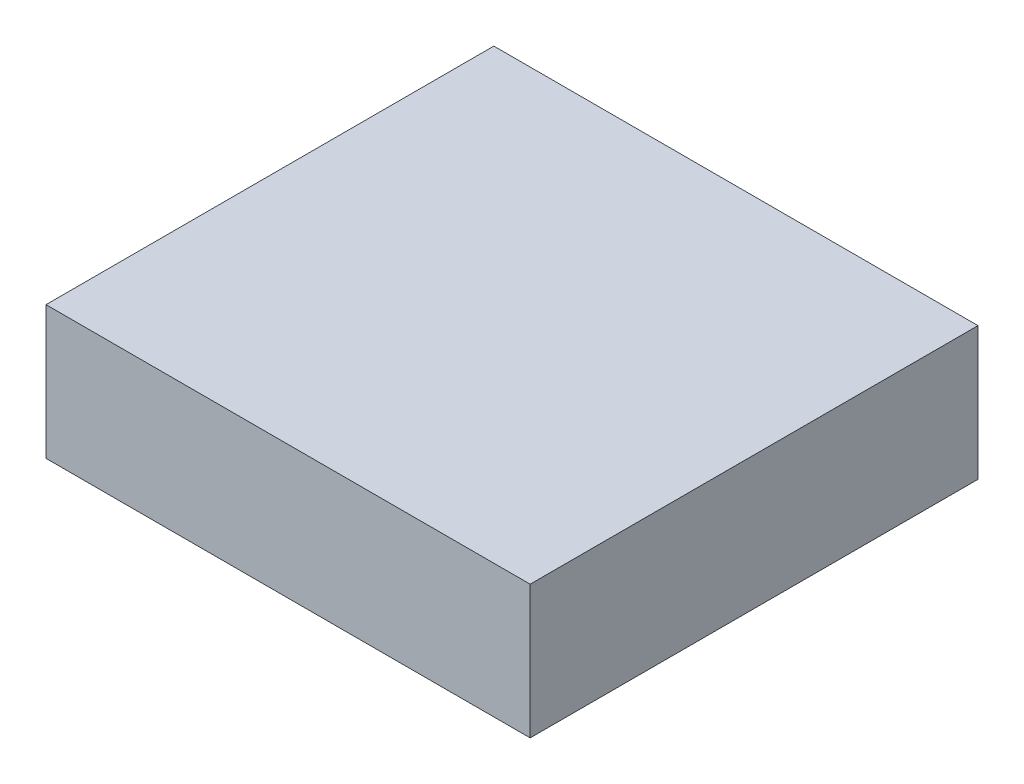
ISO-10303-21;
HEADER;
FILE_DESCRIPTION(('STEP AP214'),'2;1');
FILE_NAME('part.step','',(''),(''),'','','');
FILE_SCHEMA(('AUTOMOTIVE_DESIGN { 1 0 10303 214 1 1 1 1 }'));
ENDSEC;
DATA;
#1=APPLICATION_CONTEXT('core data for automotive mechanical design processes');
#2=APPLICATION_PROTOCOL_DEFINITION('international standard','automotive_design',2000,#1);
#3=PRODUCT_CONTEXT('',#1,'mechanical');
#4=PRODUCT('Part','Part','',(#3));
#5=PRODUCT_RELATED_PRODUCT_CATEGORY('part','',(#4));
#6=PRODUCT_DEFINITION_FORMATION('','',#4);
#7=PRODUCT_DEFINITION_CONTEXT('part definition',#1,'design');
#8=PRODUCT_DEFINITION('design','',#6,#7);
#9=PRODUCT_DEFINITION_SHAPE('','',#8);
#10=(LENGTH_UNIT() NAMED_UNIT(*) SI_UNIT(.MILLI.,.METRE.));
#11=(NAMED_UNIT(*) PLANE_ANGLE_UNIT() SI_UNIT($,.RADIAN.));
#12=(NAMED_UNIT(*) SI_UNIT($,.STERADIAN.) SOLID_ANGLE_UNIT());
#13=UNCERTAINTY_MEASURE_WITH_UNIT(LENGTH_MEASURE(1.E-05),#10,'distance_accuracy_value','');
#14=(GEOMETRIC_REPRESENTATION_CONTEXT(3) GLOBAL_UNCERTAINTY_ASSIGNED_CONTEXT((#13)) GLOBAL_UNIT_ASSIGNED_CONTEXT((#10,
#11,#12)) REPRESENTATION_CONTEXT('',''));
#15=CARTESIAN_POINT('',(0.,0.,0.));
#16=DIRECTION('',(0.,0.,1.));
#17=DIRECTION('',(1.,0.,0.));
#18=AXIS2_PLACEMENT_3D('',#15,#16,#17);
#19=CARTESIAN_POINT('',(50.8,27.94,-46.99));
#20=DIRECTION('',(-1.,0.,0.));
#21=DIRECTION('',(0.,0.,1.));
#22=AXIS2_PLACEMENT_3D('',#19,#20,#21);
#23=PLANE('',#22);
#24=DIRECTION('',(0.,0.,-1.));
#25=VECTOR('',#24,1.);
#26=CARTESIAN_POINT('',(50.8,0.,-46.99));
#27=LINE('',#26,#25);
#28=CARTESIAN_POINT('',(50.8,0.,46.99));
#29=VERTEX_POINT('',#28);
#30=CARTESIAN_POINT('',(50.8,0.,-46.99));
#31=VERTEX_POINT('',#30);
#32=EDGE_CURVE('E99',#29,#31,#27,.T.);
#33=ORIENTED_EDGE('',*,*,#32,.T.);
#34=DIRECTION('',(0.,-1.,0.));
#35=VECTOR('',#34,1.);
#36=CARTESIAN_POINT('',(50.8,27.94,-46.99));
#37=LINE('',#36,#35);
#38=CARTESIAN_POINT('',(50.8,27.94,-46.99));
#39=VERTEX_POINT('',#38);
#40=EDGE_CURVE('E11',#39,#31,#37,.T.);
#41=ORIENTED_EDGE('',*,*,#40,.F.);
#42=DIRECTION('',(0.,0.,-1.));
#43=VECTOR('',#42,1.);
#44=CARTESIAN_POINT('',(50.8,27.94,-46.99));
#45=LINE('',#44,#43);
#46=CARTESIAN_POINT('',(50.8,27.94,46.99));
#47=VERTEX_POINT('',#46);
#48=EDGE_CURVE('E87',#47,#39,#45,.T.);
#49=ORIENTED_EDGE('',*,*,#48,.F.);
#50=DIRECTION('',(0.,-1.,0.));
#51=VECTOR('',#50,1.);
#52=CARTESIAN_POINT('',(50.8,27.94,46.99));
#53=LINE('',#52,#51);
#54=EDGE_CURVE('E95',#47,#29,#53,.T.);
#55=ORIENTED_EDGE('',*,*,#54,.T.);
#56=EDGE_LOOP('',(#33,#41,#49,#55));
#57=FACE_BOUND('',#56,.T.);
#58=ADVANCED_FACE('F36',(#57),#23,.F.);
#59=CARTESIAN_POINT('',(-50.8,27.94,-46.99));
#60=DIRECTION('',(0.,0.,1.));
#61=DIRECTION('',(1.,0.,0.));
#62=AXIS2_PLACEMENT_3D('',#59,#60,#61);
#63=PLANE('',#62);
#64=DIRECTION('',(-1.,0.,0.));
#65=VECTOR('',#64,1.);
#66=CARTESIAN_POINT('',(-50.8,0.,-46.99));
#67=LINE('',#66,#65);
#68=CARTESIAN_POINT('',(-50.8,0.,-46.99));
#69=VERTEX_POINT('',#68);
#70=EDGE_CURVE('E91',#31,#69,#67,.T.);
#71=ORIENTED_EDGE('',*,*,#70,.T.);
#72=DIRECTION('',(0.,-1.,0.));
#73=VECTOR('',#72,1.);
#74=CARTESIAN_POINT('',(-50.8,27.94,-46.99));
#75=LINE('',#74,#73);
#76=CARTESIAN_POINT('',(-50.8,27.94,-46.99));
#77=VERTEX_POINT('',#76);
#78=EDGE_CURVE('E44',#77,#69,#75,.T.);
#79=ORIENTED_EDGE('',*,*,#78,.F.);
#80=DIRECTION('',(-1.,0.,0.));
#81=VECTOR('',#80,1.);
#82=CARTESIAN_POINT('',(-50.8,27.94,-46.99));
#83=LINE('',#82,#81);
#84=EDGE_CURVE('E82',#39,#77,#83,.T.);
#85=ORIENTED_EDGE('',*,*,#84,.F.);
#86=ORIENTED_EDGE('',*,*,#40,.T.);
#87=EDGE_LOOP('',(#71,#79,#85,#86));
#88=FACE_BOUND('',#87,.T.);
#89=ADVANCED_FACE('F90',(#88),#63,.F.);
#90=CARTESIAN_POINT('',(-50.8,27.94,-46.99));
#91=DIRECTION('',(1.,0.,0.));
#92=DIRECTION('',(0.,0.,-1.));
#93=AXIS2_PLACEMENT_3D('',#90,#91,#92);
#94=PLANE('',#93);
#95=DIRECTION('',(0.,0.,1.));
#96=VECTOR('',#95,1.);
#97=CARTESIAN_POINT('',(-50.8,0.,-46.99));
#98=LINE('',#97,#96);
#99=CARTESIAN_POINT('',(-50.8,0.,46.99));
#100=VERTEX_POINT('',#99);
#101=EDGE_CURVE('E69',#69,#100,#98,.T.);
#102=ORIENTED_EDGE('',*,*,#101,.T.);
#103=DIRECTION('',(0.,-1.,0.));
#104=VECTOR('',#103,1.);
#105=CARTESIAN_POINT('',(-50.8,27.94,46.99));
#106=LINE('',#105,#104);
#107=CARTESIAN_POINT('',(-50.8,27.94,46.99));
#108=VERTEX_POINT('',#107);
#109=EDGE_CURVE('E92',#108,#100,#106,.T.);
#110=ORIENTED_EDGE('',*,*,#109,.F.);
#111=DIRECTION('',(0.,0.,1.));
#112=VECTOR('',#111,1.);
#113=CARTESIAN_POINT('',(-50.8,27.94,-46.99));
#114=LINE('',#113,#112);
#115=EDGE_CURVE('E85',#77,#108,#114,.T.);
#116=ORIENTED_EDGE('',*,*,#115,.F.);
#117=ORIENTED_EDGE('',*,*,#78,.T.);
#118=EDGE_LOOP('',(#102,#110,#116,#117));
#119=FACE_BOUND('',#118,.T.);
#120=ADVANCED_FACE('F93',(#119),#94,.F.);
#121=CARTESIAN_POINT('',(-50.8,27.94,46.99));
#122=DIRECTION('',(0.,0.,-1.));
#123=DIRECTION('',(-1.,0.,0.));
#124=AXIS2_PLACEMENT_3D('',#121,#122,#123);
#125=PLANE('',#124);
#126=DIRECTION('',(1.,0.,0.));
#127=VECTOR('',#126,1.);
#128=CARTESIAN_POINT('',(-50.8,0.,46.99));
#129=LINE('',#128,#127);
#130=EDGE_CURVE('E75',#100,#29,#129,.T.);
#131=ORIENTED_EDGE('',*,*,#130,.T.);
#132=ORIENTED_EDGE('',*,*,#54,.F.);
#133=DIRECTION('',(1.,0.,0.));
#134=VECTOR('',#133,1.);
#135=CARTESIAN_POINT('',(-50.8,27.94,46.99));
#136=LINE('',#135,#134);
#137=EDGE_CURVE('E52',#108,#47,#136,.T.);
#138=ORIENTED_EDGE('',*,*,#137,.F.);
#139=ORIENTED_EDGE('',*,*,#109,.T.);
#140=EDGE_LOOP('',(#131,#132,#138,#139));
#141=FACE_BOUND('',#140,.T.);
#142=ADVANCED_FACE('F106',(#141),#125,.F.);
#143=CARTESIAN_POINT('',(0.,27.94,0.));
#144=DIRECTION('',(0.,1.,0.));
#145=DIRECTION('',(0.,0.,1.));
#146=AXIS2_PLACEMENT_3D('',#143,#144,#145);
#147=PLANE('',#146);
#148=ORIENTED_EDGE('',*,*,#48,.T.);
#149=ORIENTED_EDGE('',*,*,#84,.T.);
#150=ORIENTED_EDGE('',*,*,#115,.T.);
#151=ORIENTED_EDGE('',*,*,#137,.T.);
#152=EDGE_LOOP('',(#148,#149,#150,#151));
#153=FACE_BOUND('',#152,.T.);
#154=ADVANCED_FACE('F83',(#153),#147,.T.);
#155=CARTESIAN_POINT('',(0.,0.,0.));
#156=DIRECTION('',(0.,1.,0.));
#157=DIRECTION('',(0.,0.,1.));
#158=AXIS2_PLACEMENT_3D('',#155,#156,#157);
#159=PLANE('',#158);
#160=ORIENTED_EDGE('',*,*,#32,.F.);
#161=ORIENTED_EDGE('',*,*,#130,.F.);
#162=ORIENTED_EDGE('',*,*,#101,.F.);
#163=ORIENTED_EDGE('',*,*,#70,.F.);
#164=EDGE_LOOP('',(#160,#161,#162,#163));
#165=FACE_BOUND('',#164,.T.);
#166=ADVANCED_FACE('F109',(#165),#159,.F.);
#167=CLOSED_SHELL('',(#58,#89,#120,#142,#154,#166));
#168=MANIFOLD_SOLID_BREP('B2',#167);
#169=ADVANCED_BREP_SHAPE_REPRESENTATION('',(#18,#168),#14);
#170=SHAPE_DEFINITION_REPRESENTATION(#9,#169);
ENDSEC;
END-ISO-10303-21;
